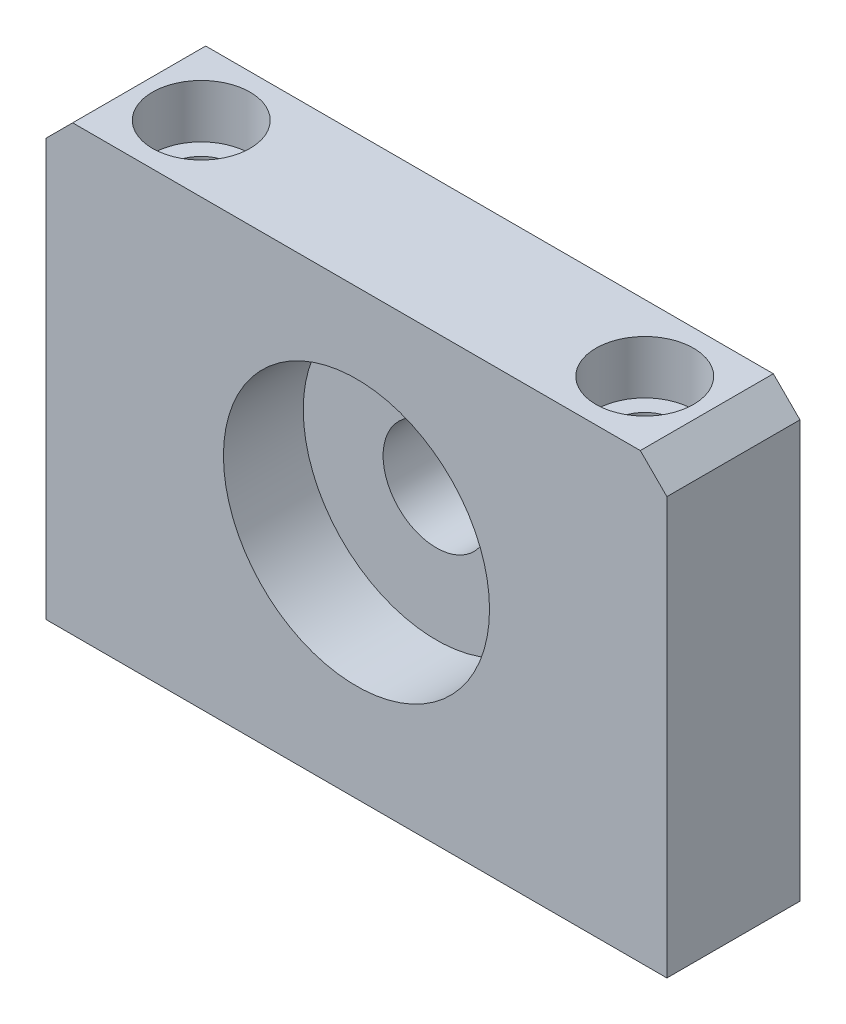
ISO-10303-21;
HEADER;
FILE_DESCRIPTION(('STEP AP214'),'2;1');
FILE_NAME('part.step','',(''),(''),'','','');
FILE_SCHEMA(('AUTOMOTIVE_DESIGN { 1 0 10303 214 1 1 1 1 }'));
ENDSEC;
DATA;
#1=APPLICATION_CONTEXT('core data for automotive mechanical design processes');
#2=APPLICATION_PROTOCOL_DEFINITION('international standard','automotive_design',2000,#1);
#3=PRODUCT_CONTEXT('',#1,'mechanical');
#4=PRODUCT('Part','Part','',(#3));
#5=PRODUCT_RELATED_PRODUCT_CATEGORY('part','',(#4));
#6=PRODUCT_DEFINITION_FORMATION('','',#4);
#7=PRODUCT_DEFINITION_CONTEXT('part definition',#1,'design');
#8=PRODUCT_DEFINITION('design','',#6,#7);
#9=PRODUCT_DEFINITION_SHAPE('','',#8);
#10=(LENGTH_UNIT() NAMED_UNIT(*) SI_UNIT(.MILLI.,.METRE.));
#11=(NAMED_UNIT(*) PLANE_ANGLE_UNIT() SI_UNIT($,.RADIAN.));
#12=(NAMED_UNIT(*) SI_UNIT($,.STERADIAN.) SOLID_ANGLE_UNIT());
#13=UNCERTAINTY_MEASURE_WITH_UNIT(LENGTH_MEASURE(1.E-05),#10,'distance_accuracy_value','');
#14=(GEOMETRIC_REPRESENTATION_CONTEXT(3) GLOBAL_UNCERTAINTY_ASSIGNED_CONTEXT((#13)) GLOBAL_UNIT_ASSIGNED_CONTEXT((#10,
#11,#12)) REPRESENTATION_CONTEXT('',''));
#15=CARTESIAN_POINT('',(0.,0.,0.));
#16=DIRECTION('',(0.,0.,1.));
#17=DIRECTION('',(1.,0.,0.));
#18=AXIS2_PLACEMENT_3D('',#15,#16,#17);
#19=CARTESIAN_POINT('',(35.,26.,0.));
#20=DIRECTION('',(0.,0.,1.));
#21=DIRECTION('',(1.,0.,0.));
#22=AXIS2_PLACEMENT_3D('',#19,#20,#21);
#23=CYLINDRICAL_SURFACE('',#22,6.);
#24=CARTESIAN_POINT('',(35.,26.,0.));
#25=DIRECTION('',(0.,0.,1.));
#26=DIRECTION('',(1.,0.,0.));
#27=AXIS2_PLACEMENT_3D('',#24,#25,#26);
#28=CIRCLE('',#27,6.);
#29=CARTESIAN_POINT('',(41.,26.,0.));
#30=VERTEX_POINT('',#29);
#31=EDGE_CURVE('E146',#30,#30,#28,.T.);
#32=ORIENTED_EDGE('',*,*,#31,.F.);
#33=EDGE_LOOP('',(#32));
#34=FACE_BOUND('',#33,.T.);
#35=CARTESIAN_POINT('',(35.,26.,6.));
#36=DIRECTION('',(0.,0.,1.));
#37=DIRECTION('',(1.,0.,0.));
#38=AXIS2_PLACEMENT_3D('',#35,#36,#37);
#39=CIRCLE('',#38,6.);
#40=CARTESIAN_POINT('',(41.,26.,6.));
#41=VERTEX_POINT('',#40);
#42=EDGE_CURVE('E38',#41,#41,#39,.F.);
#43=ORIENTED_EDGE('',*,*,#42,.F.);
#44=EDGE_LOOP('',(#43));
#45=FACE_BOUND('',#44,.T.);
#46=ADVANCED_FACE('F34',(#34,#45),#23,.F.);
#47=CARTESIAN_POINT('',(0.,0.,15.));
#48=DIRECTION('',(1.,0.,0.));
#49=DIRECTION('',(0.,0.,-1.));
#50=AXIS2_PLACEMENT_3D('',#47,#48,#49);
#51=PLANE('',#50);
#52=DIRECTION('',(0.,-1.,0.));
#53=VECTOR('',#52,1.);
#54=CARTESIAN_POINT('',(0.,0.,15.));
#55=LINE('',#54,#53);
#56=CARTESIAN_POINT('',(0.,47.,15.));
#57=VERTEX_POINT('',#56);
#58=CARTESIAN_POINT('',(0.,0.,15.));
#59=VERTEX_POINT('',#58);
#60=EDGE_CURVE('E88',#57,#59,#55,.T.);
#61=ORIENTED_EDGE('',*,*,#60,.F.);
#62=DIRECTION('',(0.,0.,-1.));
#63=VECTOR('',#62,1.);
#64=CARTESIAN_POINT('',(0.,47.,15.));
#65=LINE('',#64,#63);
#66=CARTESIAN_POINT('',(0.,47.,0.));
#67=VERTEX_POINT('',#66);
#68=EDGE_CURVE('E11',#57,#67,#65,.T.);
#69=ORIENTED_EDGE('',*,*,#68,.T.);
#70=DIRECTION('',(0.,-1.,0.));
#71=VECTOR('',#70,1.);
#72=CARTESIAN_POINT('',(0.,0.,0.));
#73=LINE('',#72,#71);
#74=CARTESIAN_POINT('',(0.,0.,0.));
#75=VERTEX_POINT('',#74);
#76=EDGE_CURVE('E108',#67,#75,#73,.T.);
#77=ORIENTED_EDGE('',*,*,#76,.T.);
#78=DIRECTION('',(0.,0.,-1.));
#79=VECTOR('',#78,1.);
#80=CARTESIAN_POINT('',(0.,0.,15.));
#81=LINE('',#80,#79);
#82=EDGE_CURVE('E101',#59,#75,#81,.T.);
#83=ORIENTED_EDGE('',*,*,#82,.F.);
#84=EDGE_LOOP('',(#61,#69,#77,#83));
#85=FACE_BOUND('',#84,.T.);
#86=ADVANCED_FACE('F106',(#85),#51,.F.);
#87=CARTESIAN_POINT('',(0.,0.,15.));
#88=DIRECTION('',(0.,1.,0.));
#89=DIRECTION('',(0.,0.,1.));
#90=AXIS2_PLACEMENT_3D('',#87,#88,#89);
#91=PLANE('',#90);
#92=CARTESIAN_POINT('',(10.,0.,7.49999999999999));
#93=DIRECTION('',(0.,1.,0.));
#94=DIRECTION('',(0.,0.,1.));
#95=AXIS2_PLACEMENT_3D('',#92,#93,#94);
#96=CIRCLE('',#95,3.49999999999999);
#97=CARTESIAN_POINT('',(10.,0.,11.));
#98=VERTEX_POINT('',#97);
#99=EDGE_CURVE('E163',#98,#98,#96,.T.);
#100=ORIENTED_EDGE('',*,*,#99,.T.);
#101=EDGE_LOOP('',(#100));
#102=FACE_BOUND('',#101,.T.);
#103=CARTESIAN_POINT('',(60.,0.,7.49999999999999));
#104=DIRECTION('',(0.,1.,0.));
#105=DIRECTION('',(0.,0.,1.));
#106=AXIS2_PLACEMENT_3D('',#103,#104,#105);
#107=CIRCLE('',#106,3.49999999999998);
#108=CARTESIAN_POINT('',(60.,0.,11.));
#109=VERTEX_POINT('',#108);
#110=EDGE_CURVE('E151',#109,#109,#107,.T.);
#111=ORIENTED_EDGE('',*,*,#110,.T.);
#112=EDGE_LOOP('',(#111));
#113=FACE_BOUND('',#112,.T.);
#114=DIRECTION('',(1.,0.,0.));
#115=VECTOR('',#114,1.);
#116=CARTESIAN_POINT('',(0.,0.,0.));
#117=LINE('',#116,#115);
#118=CARTESIAN_POINT('',(70.,0.,0.));
#119=VERTEX_POINT('',#118);
#120=EDGE_CURVE('E142',#75,#119,#117,.T.);
#121=ORIENTED_EDGE('',*,*,#120,.T.);
#122=DIRECTION('',(0.,0.,-1.));
#123=VECTOR('',#122,1.);
#124=CARTESIAN_POINT('',(70.,0.,15.));
#125=LINE('',#124,#123);
#126=CARTESIAN_POINT('',(70.,0.,15.));
#127=VERTEX_POINT('',#126);
#128=EDGE_CURVE('E103',#127,#119,#125,.T.);
#129=ORIENTED_EDGE('',*,*,#128,.F.);
#130=DIRECTION('',(1.,0.,0.));
#131=VECTOR('',#130,1.);
#132=CARTESIAN_POINT('',(0.,0.,15.));
#133=LINE('',#132,#131);
#134=EDGE_CURVE('E91',#59,#127,#133,.T.);
#135=ORIENTED_EDGE('',*,*,#134,.F.);
#136=ORIENTED_EDGE('',*,*,#82,.T.);
#137=EDGE_LOOP('',(#121,#129,#135,#136));
#138=FACE_BOUND('',#137,.T.);
#139=ADVANCED_FACE('F100',(#102,#113,#138),#91,.F.);
#140=CARTESIAN_POINT('',(70.,0.,15.));
#141=DIRECTION('',(-1.,0.,0.));
#142=DIRECTION('',(0.,0.,1.));
#143=AXIS2_PLACEMENT_3D('',#140,#141,#142);
#144=PLANE('',#143);
#145=DIRECTION('',(0.,1.,0.));
#146=VECTOR('',#145,1.);
#147=CARTESIAN_POINT('',(70.,0.,0.));
#148=LINE('',#147,#146);
#149=CARTESIAN_POINT('',(70.,47.,0.));
#150=VERTEX_POINT('',#149);
#151=EDGE_CURVE('E140',#119,#150,#148,.T.);
#152=ORIENTED_EDGE('',*,*,#151,.T.);
#153=DIRECTION('',(0.,0.,1.));
#154=VECTOR('',#153,1.);
#155=CARTESIAN_POINT('',(70.,47.,15.));
#156=LINE('',#155,#154);
#157=CARTESIAN_POINT('',(70.,47.,15.));
#158=VERTEX_POINT('',#157);
#159=EDGE_CURVE('E58',#150,#158,#156,.T.);
#160=ORIENTED_EDGE('',*,*,#159,.T.);
#161=DIRECTION('',(0.,1.,0.));
#162=VECTOR('',#161,1.);
#163=CARTESIAN_POINT('',(70.,0.,15.));
#164=LINE('',#163,#162);
#165=EDGE_CURVE('E104',#127,#158,#164,.T.);
#166=ORIENTED_EDGE('',*,*,#165,.F.);
#167=ORIENTED_EDGE('',*,*,#128,.T.);
#168=EDGE_LOOP('',(#152,#160,#166,#167));
#169=FACE_BOUND('',#168,.T.);
#170=ADVANCED_FACE('F141',(#169),#144,.F.);
#171=CARTESIAN_POINT('',(0.,50.,15.));
#172=DIRECTION('',(0.,-1.,0.));
#173=DIRECTION('',(0.,0.,-1.));
#174=AXIS2_PLACEMENT_3D('',#171,#172,#173);
#175=PLANE('',#174);
#176=CARTESIAN_POINT('',(10.,50.,7.49999999999999));
#177=DIRECTION('',(0.,1.,0.));
#178=DIRECTION('',(0.,0.,1.));
#179=AXIS2_PLACEMENT_3D('',#176,#177,#178);
#180=CIRCLE('',#179,5.5);
#181=CARTESIAN_POINT('',(10.,50.,13.));
#182=VERTEX_POINT('',#181);
#183=EDGE_CURVE('E172',#182,#182,#180,.T.);
#184=ORIENTED_EDGE('',*,*,#183,.F.);
#185=EDGE_LOOP('',(#184));
#186=FACE_BOUND('',#185,.T.);
#187=CARTESIAN_POINT('',(60.,50.,7.49999999999999));
#188=DIRECTION('',(0.,1.,0.));
#189=DIRECTION('',(0.,0.,1.));
#190=AXIS2_PLACEMENT_3D('',#187,#188,#189);
#191=CIRCLE('',#190,5.5);
#192=CARTESIAN_POINT('',(60.,50.,13.));
#193=VERTEX_POINT('',#192);
#194=EDGE_CURVE('E160',#193,#193,#191,.T.);
#195=ORIENTED_EDGE('',*,*,#194,.F.);
#196=EDGE_LOOP('',(#195));
#197=FACE_BOUND('',#196,.T.);
#198=DIRECTION('',(-1.,0.,0.));
#199=VECTOR('',#198,1.);
#200=CARTESIAN_POINT('',(0.,50.,15.));
#201=LINE('',#200,#199);
#202=CARTESIAN_POINT('',(67.,50.,15.));
#203=VERTEX_POINT('',#202);
#204=CARTESIAN_POINT('',(3.00000000000001,50.,15.));
#205=VERTEX_POINT('',#204);
#206=EDGE_CURVE('E114',#203,#205,#201,.T.);
#207=ORIENTED_EDGE('',*,*,#206,.F.);
#208=DIRECTION('',(0.,0.,-1.));
#209=VECTOR('',#208,1.);
#210=CARTESIAN_POINT('',(67.,50.,15.));
#211=LINE('',#210,#209);
#212=CARTESIAN_POINT('',(67.,50.,0.));
#213=VERTEX_POINT('',#212);
#214=EDGE_CURVE('E112',#203,#213,#211,.T.);
#215=ORIENTED_EDGE('',*,*,#214,.T.);
#216=DIRECTION('',(-1.,0.,0.));
#217=VECTOR('',#216,1.);
#218=CARTESIAN_POINT('',(0.,50.,0.));
#219=LINE('',#218,#217);
#220=CARTESIAN_POINT('',(3.00000000000001,50.,0.));
#221=VERTEX_POINT('',#220);
#222=EDGE_CURVE('E96',#213,#221,#219,.T.);
#223=ORIENTED_EDGE('',*,*,#222,.T.);
#224=DIRECTION('',(0.,0.,1.));
#225=VECTOR('',#224,1.);
#226=CARTESIAN_POINT('',(3.00000000000001,50.,15.));
#227=LINE('',#226,#225);
#228=EDGE_CURVE('E110',#221,#205,#227,.T.);
#229=ORIENTED_EDGE('',*,*,#228,.T.);
#230=EDGE_LOOP('',(#207,#215,#223,#229));
#231=FACE_BOUND('',#230,.T.);
#232=ADVANCED_FACE('F131',(#186,#197,#231),#175,.F.);
#233=CARTESIAN_POINT('',(0.,50.,15.));
#234=DIRECTION('',(0.,0.,-1.));
#235=DIRECTION('',(-1.,0.,0.));
#236=AXIS2_PLACEMENT_3D('',#233,#234,#235);
#237=PLANE('',#236);
#238=CARTESIAN_POINT('',(35.,26.,15.));
#239=DIRECTION('',(0.,0.,1.));
#240=DIRECTION('',(1.,0.,0.));
#241=AXIS2_PLACEMENT_3D('',#238,#239,#240);
#242=CIRCLE('',#241,15.);
#243=CARTESIAN_POINT('',(50.,26.,15.));
#244=VERTEX_POINT('',#243);
#245=EDGE_CURVE('E175',#244,#244,#242,.T.);
#246=ORIENTED_EDGE('',*,*,#245,.F.);
#247=EDGE_LOOP('',(#246));
#248=FACE_BOUND('',#247,.T.);
#249=ORIENTED_EDGE('',*,*,#165,.T.);
#250=DIRECTION('',(0.707106781186545,-0.70710678118655,0.));
#251=VECTOR('',#250,1.);
#252=CARTESIAN_POINT('',(67.,50.,15.));
#253=LINE('',#252,#251);
#254=EDGE_CURVE('E43',#158,#203,#253,.F.);
#255=ORIENTED_EDGE('',*,*,#254,.T.);
#256=ORIENTED_EDGE('',*,*,#206,.T.);
#257=DIRECTION('',(0.70710678118655,0.707106781186545,0.));
#258=VECTOR('',#257,1.);
#259=CARTESIAN_POINT('',(0.,47.,15.));
#260=LINE('',#259,#258);
#261=EDGE_CURVE('E50',#205,#57,#260,.F.);
#262=ORIENTED_EDGE('',*,*,#261,.T.);
#263=ORIENTED_EDGE('',*,*,#60,.T.);
#264=ORIENTED_EDGE('',*,*,#134,.T.);
#265=EDGE_LOOP('',(#249,#255,#256,#262,#263,#264));
#266=FACE_BOUND('',#265,.T.);
#267=ADVANCED_FACE('F90',(#248,#266),#237,.F.);
#268=CARTESIAN_POINT('',(0.,50.,0.));
#269=DIRECTION('',(0.,0.,-1.));
#270=DIRECTION('',(-1.,0.,0.));
#271=AXIS2_PLACEMENT_3D('',#268,#269,#270);
#272=PLANE('',#271);
#273=ORIENTED_EDGE('',*,*,#31,.T.);
#274=EDGE_LOOP('',(#273));
#275=FACE_BOUND('',#274,.T.);
#276=ORIENTED_EDGE('',*,*,#222,.F.);
#277=DIRECTION('',(-0.707106781186545,0.70710678118655,0.));
#278=VECTOR('',#277,1.);
#279=CARTESIAN_POINT('',(33.5000000000002,83.5,0.));
#280=LINE('',#279,#278);
#281=EDGE_CURVE('E122',#213,#150,#280,.F.);
#282=ORIENTED_EDGE('',*,*,#281,.T.);
#283=ORIENTED_EDGE('',*,*,#151,.F.);
#284=ORIENTED_EDGE('',*,*,#120,.F.);
#285=ORIENTED_EDGE('',*,*,#76,.F.);
#286=DIRECTION('',(-0.70710678118655,-0.707106781186545,0.));
#287=VECTOR('',#286,1.);
#288=CARTESIAN_POINT('',(1.49999999999999,48.5,0.));
#289=LINE('',#288,#287);
#290=EDGE_CURVE('E120',#67,#221,#289,.F.);
#291=ORIENTED_EDGE('',*,*,#290,.T.);
#292=EDGE_LOOP('',(#276,#282,#283,#284,#285,#291));
#293=FACE_BOUND('',#292,.T.);
#294=ADVANCED_FACE('F139',(#275,#293),#272,.T.);
#295=CARTESIAN_POINT('',(67.,50.,15.));
#296=DIRECTION('',(-0.70710678118655,-0.707106781186545,0.));
#297=DIRECTION('',(0.707106781186545,-0.70710678118655,0.));
#298=AXIS2_PLACEMENT_3D('',#295,#296,#297);
#299=PLANE('',#298);
#300=ORIENTED_EDGE('',*,*,#254,.F.);
#301=ORIENTED_EDGE('',*,*,#159,.F.);
#302=ORIENTED_EDGE('',*,*,#281,.F.);
#303=ORIENTED_EDGE('',*,*,#214,.F.);
#304=EDGE_LOOP('',(#300,#301,#302,#303));
#305=FACE_BOUND('',#304,.T.);
#306=ADVANCED_FACE('F136',(#305),#299,.F.);
#307=CARTESIAN_POINT('',(0.,47.,15.));
#308=DIRECTION('',(0.707106781186545,-0.70710678118655,0.));
#309=DIRECTION('',(0.70710678118655,0.707106781186545,0.));
#310=AXIS2_PLACEMENT_3D('',#307,#308,#309);
#311=PLANE('',#310);
#312=ORIENTED_EDGE('',*,*,#261,.F.);
#313=ORIENTED_EDGE('',*,*,#228,.F.);
#314=ORIENTED_EDGE('',*,*,#290,.F.);
#315=ORIENTED_EDGE('',*,*,#68,.F.);
#316=EDGE_LOOP('',(#312,#313,#314,#315));
#317=FACE_BOUND('',#316,.T.);
#318=ADVANCED_FACE('F36',(#317),#311,.F.);
#319=CARTESIAN_POINT('',(60.,50.,7.49999999999999));
#320=DIRECTION('',(0.,1.,0.));
#321=DIRECTION('',(0.,0.,1.));
#322=AXIS2_PLACEMENT_3D('',#319,#320,#321);
#323=CYLINDRICAL_SURFACE('',#322,3.49999999999999);
#324=ORIENTED_EDGE('',*,*,#110,.F.);
#325=EDGE_LOOP('',(#324));
#326=FACE_BOUND('',#325,.T.);
#327=CARTESIAN_POINT('',(60.,44.,7.49999999999999));
#328=DIRECTION('',(0.,1.,0.));
#329=DIRECTION('',(0.,0.,1.));
#330=AXIS2_PLACEMENT_3D('',#327,#328,#329);
#331=CIRCLE('',#330,3.5);
#332=CARTESIAN_POINT('',(60.,44.,11.));
#333=VERTEX_POINT('',#332);
#334=EDGE_CURVE('E154',#333,#333,#331,.T.);
#335=ORIENTED_EDGE('',*,*,#334,.T.);
#336=EDGE_LOOP('',(#335));
#337=FACE_BOUND('',#336,.T.);
#338=ADVANCED_FACE('F197',(#326,#337),#323,.F.);
#339=CARTESIAN_POINT('',(63.5,44.,7.49999999999999));
#340=DIRECTION('',(0.,-1.,0.));
#341=DIRECTION('',(0.,0.,-1.));
#342=AXIS2_PLACEMENT_3D('',#339,#340,#341);
#343=PLANE('',#342);
#344=ORIENTED_EDGE('',*,*,#334,.F.);
#345=EDGE_LOOP('',(#344));
#346=FACE_BOUND('',#345,.T.);
#347=CARTESIAN_POINT('',(60.,44.,7.49999999999999));
#348=DIRECTION('',(0.,1.,0.));
#349=DIRECTION('',(0.,0.,1.));
#350=AXIS2_PLACEMENT_3D('',#347,#348,#349);
#351=CIRCLE('',#350,5.5);
#352=CARTESIAN_POINT('',(60.,44.,13.));
#353=VERTEX_POINT('',#352);
#354=EDGE_CURVE('E157',#353,#353,#351,.T.);
#355=ORIENTED_EDGE('',*,*,#354,.T.);
#356=EDGE_LOOP('',(#355));
#357=FACE_BOUND('',#356,.T.);
#358=ADVANCED_FACE('F220',(#346,#357),#343,.F.);
#359=CARTESIAN_POINT('',(60.,50.,7.49999999999999));
#360=DIRECTION('',(0.,1.,0.));
#361=DIRECTION('',(0.,0.,1.));
#362=AXIS2_PLACEMENT_3D('',#359,#360,#361);
#363=CYLINDRICAL_SURFACE('',#362,5.5);
#364=ORIENTED_EDGE('',*,*,#354,.F.);
#365=EDGE_LOOP('',(#364));
#366=FACE_BOUND('',#365,.T.);
#367=ORIENTED_EDGE('',*,*,#194,.T.);
#368=EDGE_LOOP('',(#367));
#369=FACE_BOUND('',#368,.T.);
#370=ADVANCED_FACE('F225',(#366,#369),#363,.F.);
#371=CARTESIAN_POINT('',(10.,50.,7.49999999999999));
#372=DIRECTION('',(0.,1.,0.));
#373=DIRECTION('',(0.,0.,1.));
#374=AXIS2_PLACEMENT_3D('',#371,#372,#373);
#375=CYLINDRICAL_SURFACE('',#374,3.49999999999999);
#376=ORIENTED_EDGE('',*,*,#99,.F.);
#377=EDGE_LOOP('',(#376));
#378=FACE_BOUND('',#377,.T.);
#379=CARTESIAN_POINT('',(10.,44.,7.49999999999999));
#380=DIRECTION('',(0.,1.,0.));
#381=DIRECTION('',(0.,0.,1.));
#382=AXIS2_PLACEMENT_3D('',#379,#380,#381);
#383=CIRCLE('',#382,3.5);
#384=CARTESIAN_POINT('',(10.,44.,11.));
#385=VERTEX_POINT('',#384);
#386=EDGE_CURVE('E166',#385,#385,#383,.T.);
#387=ORIENTED_EDGE('',*,*,#386,.T.);
#388=EDGE_LOOP('',(#387));
#389=FACE_BOUND('',#388,.T.);
#390=ADVANCED_FACE('F235',(#378,#389),#375,.F.);
#391=CARTESIAN_POINT('',(13.5,44.,7.49999999999999));
#392=DIRECTION('',(0.,-1.,0.));
#393=DIRECTION('',(0.,0.,-1.));
#394=AXIS2_PLACEMENT_3D('',#391,#392,#393);
#395=PLANE('',#394);
#396=ORIENTED_EDGE('',*,*,#386,.F.);
#397=EDGE_LOOP('',(#396));
#398=FACE_BOUND('',#397,.T.);
#399=CARTESIAN_POINT('',(10.,44.,7.49999999999999));
#400=DIRECTION('',(0.,1.,0.));
#401=DIRECTION('',(0.,0.,1.));
#402=AXIS2_PLACEMENT_3D('',#399,#400,#401);
#403=CIRCLE('',#402,5.5);
#404=CARTESIAN_POINT('',(10.,44.,13.));
#405=VERTEX_POINT('',#404);
#406=EDGE_CURVE('E169',#405,#405,#403,.T.);
#407=ORIENTED_EDGE('',*,*,#406,.T.);
#408=EDGE_LOOP('',(#407));
#409=FACE_BOUND('',#408,.T.);
#410=ADVANCED_FACE('F242',(#398,#409),#395,.F.);
#411=CARTESIAN_POINT('',(10.,50.,7.49999999999999));
#412=DIRECTION('',(0.,1.,0.));
#413=DIRECTION('',(0.,0.,1.));
#414=AXIS2_PLACEMENT_3D('',#411,#412,#413);
#415=CYLINDRICAL_SURFACE('',#414,5.5);
#416=ORIENTED_EDGE('',*,*,#406,.F.);
#417=EDGE_LOOP('',(#416));
#418=FACE_BOUND('',#417,.T.);
#419=ORIENTED_EDGE('',*,*,#183,.T.);
#420=EDGE_LOOP('',(#419));
#421=FACE_BOUND('',#420,.T.);
#422=ADVANCED_FACE('F248',(#418,#421),#415,.F.);
#423=CARTESIAN_POINT('',(35.,26.,6.));
#424=DIRECTION('',(0.,0.,1.));
#425=DIRECTION('',(1.,0.,0.));
#426=AXIS2_PLACEMENT_3D('',#423,#424,#425);
#427=PLANE('',#426);
#428=CARTESIAN_POINT('',(35.,26.,6.));
#429=DIRECTION('',(0.,0.,1.));
#430=DIRECTION('',(1.,0.,0.));
#431=AXIS2_PLACEMENT_3D('',#428,#429,#430);
#432=CIRCLE('',#431,15.);
#433=CARTESIAN_POINT('',(50.,26.,6.));
#434=VERTEX_POINT('',#433);
#435=EDGE_CURVE('E178',#434,#434,#432,.T.);
#436=ORIENTED_EDGE('',*,*,#435,.T.);
#437=EDGE_LOOP('',(#436));
#438=FACE_BOUND('',#437,.T.);
#439=ORIENTED_EDGE('',*,*,#42,.T.);
#440=EDGE_LOOP('',(#439));
#441=FACE_BOUND('',#440,.T.);
#442=ADVANCED_FACE('F185',(#438,#441),#427,.T.);
#443=CARTESIAN_POINT('',(35.,26.,6.));
#444=DIRECTION('',(0.,0.,1.));
#445=DIRECTION('',(1.,0.,0.));
#446=AXIS2_PLACEMENT_3D('',#443,#444,#445);
#447=CYLINDRICAL_SURFACE('',#446,15.);
#448=ORIENTED_EDGE('',*,*,#435,.F.);
#449=EDGE_LOOP('',(#448));
#450=FACE_BOUND('',#449,.T.);
#451=ORIENTED_EDGE('',*,*,#245,.T.);
#452=EDGE_LOOP('',(#451));
#453=FACE_BOUND('',#452,.T.);
#454=ADVANCED_FACE('F253',(#450,#453),#447,.F.);
#455=CLOSED_SHELL('',(#46,#86,#139,#170,#232,#267,#294,#306,#318,#338,#358,#370,#390,#410,#422,
#442,#454));
#456=MANIFOLD_SOLID_BREP('B2',#455);
#457=ADVANCED_BREP_SHAPE_REPRESENTATION('',(#18,#456),#14);
#458=SHAPE_DEFINITION_REPRESENTATION(#9,#457);
ENDSEC;
END-ISO-10303-21;
